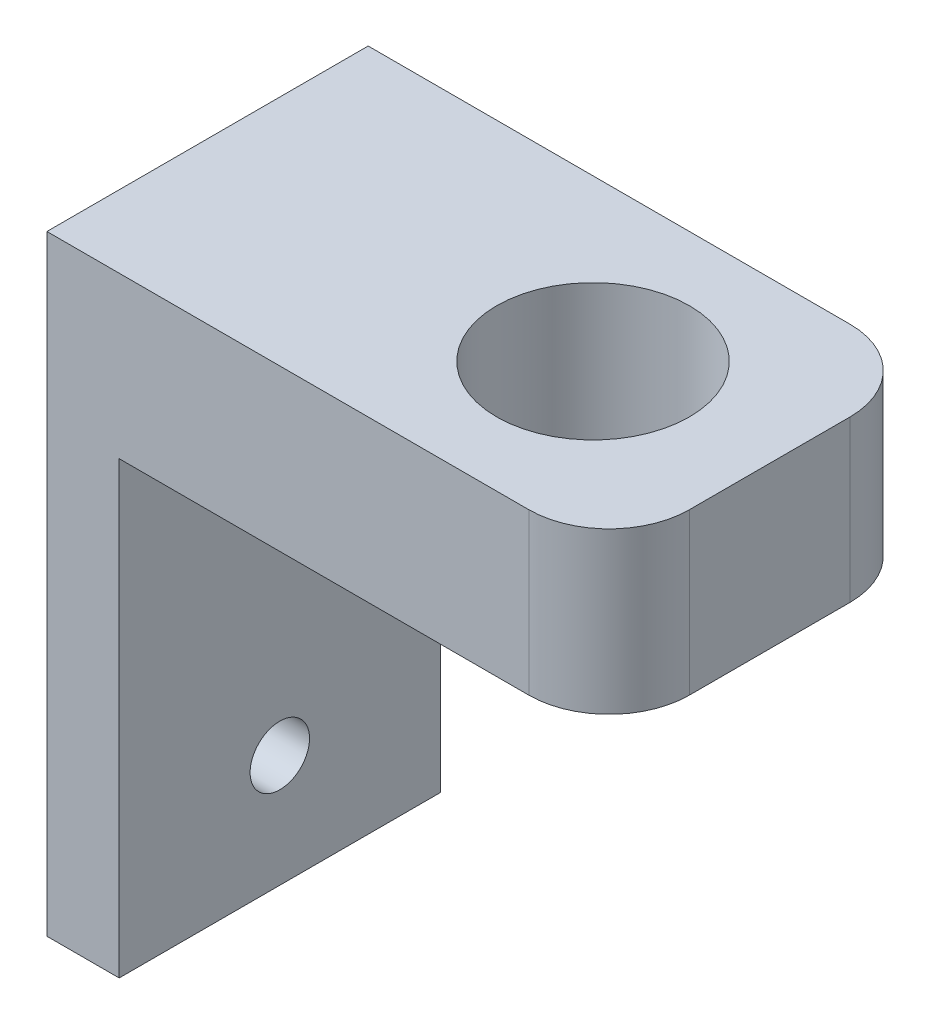
ISO-10303-21;
HEADER;
FILE_DESCRIPTION(('STEP AP214'),'2;1');
FILE_NAME('part.step','',(''),(''),'','','');
FILE_SCHEMA(('AUTOMOTIVE_DESIGN { 1 0 10303 214 1 1 1 1 }'));
ENDSEC;
DATA;
#1=APPLICATION_CONTEXT('core data for automotive mechanical design processes');
#2=APPLICATION_PROTOCOL_DEFINITION('international standard','automotive_design',2000,#1);
#3=PRODUCT_CONTEXT('',#1,'mechanical');
#4=PRODUCT('Part','Part','',(#3));
#5=PRODUCT_RELATED_PRODUCT_CATEGORY('part','',(#4));
#6=PRODUCT_DEFINITION_FORMATION('','',#4);
#7=PRODUCT_DEFINITION_CONTEXT('part definition',#1,'design');
#8=PRODUCT_DEFINITION('design','',#6,#7);
#9=PRODUCT_DEFINITION_SHAPE('','',#8);
#10=(LENGTH_UNIT() NAMED_UNIT(*) SI_UNIT(.MILLI.,.METRE.));
#11=(NAMED_UNIT(*) PLANE_ANGLE_UNIT() SI_UNIT($,.RADIAN.));
#12=(NAMED_UNIT(*) SI_UNIT($,.STERADIAN.) SOLID_ANGLE_UNIT());
#13=UNCERTAINTY_MEASURE_WITH_UNIT(LENGTH_MEASURE(1.E-05),#10,'distance_accuracy_value','');
#14=(GEOMETRIC_REPRESENTATION_CONTEXT(3) GLOBAL_UNCERTAINTY_ASSIGNED_CONTEXT((#13)) GLOBAL_UNIT_ASSIGNED_CONTEXT((#10,
#11,#12)) REPRESENTATION_CONTEXT('',''));
#15=CARTESIAN_POINT('',(0.,0.,0.));
#16=DIRECTION('',(0.,0.,1.));
#17=DIRECTION('',(1.,0.,0.));
#18=AXIS2_PLACEMENT_3D('',#15,#16,#17);
#19=CARTESIAN_POINT('',(17.5,10.,10.));
#20=DIRECTION('',(-1.,0.,0.));
#21=DIRECTION('',(0.,0.,1.));
#22=AXIS2_PLACEMENT_3D('',#19,#20,#21);
#23=PLANE('',#22);
#24=DIRECTION('',(0.,0.,-1.));
#25=VECTOR('',#24,1.);
#26=CARTESIAN_POINT('',(17.5,0.,10.));
#27=LINE('',#26,#25);
#28=CARTESIAN_POINT('',(17.5,0.,5.));
#29=VERTEX_POINT('',#28);
#30=CARTESIAN_POINT('',(17.5,0.,-5.));
#31=VERTEX_POINT('',#30);
#32=EDGE_CURVE('E153',#29,#31,#27,.T.);
#33=ORIENTED_EDGE('',*,*,#32,.T.);
#34=DIRECTION('',(0.,-1.,0.));
#35=VECTOR('',#34,1.);
#36=CARTESIAN_POINT('',(17.5,10.,-5.));
#37=LINE('',#36,#35);
#38=CARTESIAN_POINT('',(17.5,10.,-5.));
#39=VERTEX_POINT('',#38);
#40=EDGE_CURVE('E173',#31,#39,#37,.F.);
#41=ORIENTED_EDGE('',*,*,#40,.T.);
#42=DIRECTION('',(0.,0.,-1.));
#43=VECTOR('',#42,1.);
#44=CARTESIAN_POINT('',(17.5,10.,10.));
#45=LINE('',#44,#43);
#46=CARTESIAN_POINT('',(17.5,10.,5.));
#47=VERTEX_POINT('',#46);
#48=EDGE_CURVE('E155',#47,#39,#45,.T.);
#49=ORIENTED_EDGE('',*,*,#48,.F.);
#50=DIRECTION('',(0.,-1.,0.));
#51=VECTOR('',#50,1.);
#52=CARTESIAN_POINT('',(17.5,10.,5.));
#53=LINE('',#52,#51);
#54=EDGE_CURVE('E175',#47,#29,#53,.T.);
#55=ORIENTED_EDGE('',*,*,#54,.T.);
#56=EDGE_LOOP('',(#33,#41,#49,#55));
#57=FACE_BOUND('',#56,.T.);
#58=ADVANCED_FACE('F32',(#57),#23,.F.);
#59=CARTESIAN_POINT('',(-17.5,10.,-10.));
#60=DIRECTION('',(0.,0.,1.));
#61=DIRECTION('',(1.,0.,0.));
#62=AXIS2_PLACEMENT_3D('',#59,#60,#61);
#63=PLANE('',#62);
#64=DIRECTION('',(-1.,0.,0.));
#65=VECTOR('',#64,1.);
#66=CARTESIAN_POINT('',(-17.5,10.,-10.));
#67=LINE('',#66,#65);
#68=CARTESIAN_POINT('',(12.5,10.,-10.));
#69=VERTEX_POINT('',#68);
#70=CARTESIAN_POINT('',(-17.5,10.,-10.));
#71=VERTEX_POINT('',#70);
#72=EDGE_CURVE('E158',#69,#71,#67,.T.);
#73=ORIENTED_EDGE('',*,*,#72,.F.);
#74=DIRECTION('',(0.,-1.,0.));
#75=VECTOR('',#74,1.);
#76=CARTESIAN_POINT('',(12.5,10.,-10.));
#77=LINE('',#76,#75);
#78=CARTESIAN_POINT('',(12.5,0.,-10.));
#79=VERTEX_POINT('',#78);
#80=EDGE_CURVE('E109',#69,#79,#77,.T.);
#81=ORIENTED_EDGE('',*,*,#80,.T.);
#82=DIRECTION('',(-1.,0.,0.));
#83=VECTOR('',#82,1.);
#84=CARTESIAN_POINT('',(-17.5,0.,-10.));
#85=LINE('',#84,#83);
#86=CARTESIAN_POINT('',(-13.,0.,-10.));
#87=VERTEX_POINT('',#86);
#88=EDGE_CURVE('E165',#79,#87,#85,.T.);
#89=ORIENTED_EDGE('',*,*,#88,.T.);
#90=DIRECTION('',(0.,1.,0.));
#91=VECTOR('',#90,1.);
#92=CARTESIAN_POINT('',(-13.,-28.,-10.));
#93=LINE('',#92,#91);
#94=CARTESIAN_POINT('',(-13.,-28.,-10.));
#95=VERTEX_POINT('',#94);
#96=EDGE_CURVE('E116',#95,#87,#93,.T.);
#97=ORIENTED_EDGE('',*,*,#96,.F.);
#98=DIRECTION('',(1.,0.,0.));
#99=VECTOR('',#98,1.);
#100=CARTESIAN_POINT('',(-17.5,-28.,-10.));
#101=LINE('',#100,#99);
#102=CARTESIAN_POINT('',(-17.5,-28.,-10.));
#103=VERTEX_POINT('',#102);
#104=EDGE_CURVE('E113',#103,#95,#101,.T.);
#105=ORIENTED_EDGE('',*,*,#104,.F.);
#106=DIRECTION('',(0.,-1.,0.));
#107=VECTOR('',#106,1.);
#108=CARTESIAN_POINT('',(-17.5,10.,-10.));
#109=LINE('',#108,#107);
#110=EDGE_CURVE('E100',#71,#103,#109,.T.);
#111=ORIENTED_EDGE('',*,*,#110,.F.);
#112=EDGE_LOOP('',(#73,#81,#89,#97,#105,#111));
#113=FACE_BOUND('',#112,.T.);
#114=ADVANCED_FACE('F114',(#113),#63,.F.);
#115=CARTESIAN_POINT('',(-17.5,10.,10.));
#116=DIRECTION('',(1.,0.,0.));
#117=DIRECTION('',(0.,0.,-1.));
#118=AXIS2_PLACEMENT_3D('',#115,#116,#117);
#119=PLANE('',#118);
#120=CARTESIAN_POINT('',(-17.5,-6.,0.));
#121=DIRECTION('',(1.,0.,0.));
#122=DIRECTION('',(0.,0.,-1.));
#123=AXIS2_PLACEMENT_3D('',#120,#121,#122);
#124=CIRCLE('',#123,1.85);
#125=CARTESIAN_POINT('',(-17.5,-6.,-1.85));
#126=VERTEX_POINT('',#125);
#127=EDGE_CURVE('E243',#126,#126,#124,.T.);
#128=ORIENTED_EDGE('',*,*,#127,.T.);
#129=EDGE_LOOP('',(#128));
#130=FACE_BOUND('',#129,.T.);
#131=CARTESIAN_POINT('',(-17.5,-21.,0.));
#132=DIRECTION('',(1.,0.,0.));
#133=DIRECTION('',(0.,0.,-1.));
#134=AXIS2_PLACEMENT_3D('',#131,#132,#133);
#135=CIRCLE('',#134,1.85);
#136=CARTESIAN_POINT('',(-17.5,-21.,-1.85));
#137=VERTEX_POINT('',#136);
#138=EDGE_CURVE('E126',#137,#137,#135,.T.);
#139=ORIENTED_EDGE('',*,*,#138,.T.);
#140=EDGE_LOOP('',(#139));
#141=FACE_BOUND('',#140,.T.);
#142=ORIENTED_EDGE('',*,*,#110,.T.);
#143=DIRECTION('',(0.,0.,-1.));
#144=VECTOR('',#143,1.);
#145=CARTESIAN_POINT('',(-17.5,-28.,10.));
#146=LINE('',#145,#144);
#147=CARTESIAN_POINT('',(-17.5,-28.,10.));
#148=VERTEX_POINT('',#147);
#149=EDGE_CURVE('E105',#148,#103,#146,.T.);
#150=ORIENTED_EDGE('',*,*,#149,.F.);
#151=DIRECTION('',(0.,-1.,0.));
#152=VECTOR('',#151,1.);
#153=CARTESIAN_POINT('',(-17.5,10.,10.));
#154=LINE('',#153,#152);
#155=CARTESIAN_POINT('',(-17.5,10.,10.));
#156=VERTEX_POINT('',#155);
#157=EDGE_CURVE('E110',#156,#148,#154,.T.);
#158=ORIENTED_EDGE('',*,*,#157,.F.);
#159=DIRECTION('',(0.,0.,1.));
#160=VECTOR('',#159,1.);
#161=CARTESIAN_POINT('',(-17.5,10.,10.));
#162=LINE('',#161,#160);
#163=EDGE_CURVE('E106',#71,#156,#162,.T.);
#164=ORIENTED_EDGE('',*,*,#163,.F.);
#165=EDGE_LOOP('',(#142,#150,#158,#164));
#166=FACE_BOUND('',#165,.T.);
#167=ADVANCED_FACE('F102',(#130,#141,#166),#119,.F.);
#168=CARTESIAN_POINT('',(-17.5,10.,10.));
#169=DIRECTION('',(0.,0.,-1.));
#170=DIRECTION('',(-1.,0.,0.));
#171=AXIS2_PLACEMENT_3D('',#168,#169,#170);
#172=PLANE('',#171);
#173=ORIENTED_EDGE('',*,*,#157,.T.);
#174=DIRECTION('',(-1.,0.,0.));
#175=VECTOR('',#174,1.);
#176=CARTESIAN_POINT('',(-17.5,-28.,10.));
#177=LINE('',#176,#175);
#178=CARTESIAN_POINT('',(-13.,-28.,10.));
#179=VERTEX_POINT('',#178);
#180=EDGE_CURVE('E124',#179,#148,#177,.T.);
#181=ORIENTED_EDGE('',*,*,#180,.F.);
#182=DIRECTION('',(0.,1.,0.));
#183=VECTOR('',#182,1.);
#184=CARTESIAN_POINT('',(-13.,-28.,10.));
#185=LINE('',#184,#183);
#186=CARTESIAN_POINT('',(-13.,0.,10.));
#187=VERTEX_POINT('',#186);
#188=EDGE_CURVE('E134',#179,#187,#185,.T.);
#189=ORIENTED_EDGE('',*,*,#188,.T.);
#190=DIRECTION('',(1.,0.,0.));
#191=VECTOR('',#190,1.);
#192=CARTESIAN_POINT('',(-17.5,0.,10.));
#193=LINE('',#192,#191);
#194=CARTESIAN_POINT('',(12.5,0.,10.));
#195=VERTEX_POINT('',#194);
#196=EDGE_CURVE('E141',#187,#195,#193,.T.);
#197=ORIENTED_EDGE('',*,*,#196,.T.);
#198=DIRECTION('',(0.,-1.,0.));
#199=VECTOR('',#198,1.);
#200=CARTESIAN_POINT('',(12.5,10.,10.));
#201=LINE('',#200,#199);
#202=CARTESIAN_POINT('',(12.5,10.,10.));
#203=VERTEX_POINT('',#202);
#204=EDGE_CURVE('E11',#195,#203,#201,.F.);
#205=ORIENTED_EDGE('',*,*,#204,.T.);
#206=DIRECTION('',(1.,0.,0.));
#207=VECTOR('',#206,1.);
#208=CARTESIAN_POINT('',(-17.5,10.,10.));
#209=LINE('',#208,#207);
#210=EDGE_CURVE('E161',#156,#203,#209,.T.);
#211=ORIENTED_EDGE('',*,*,#210,.F.);
#212=EDGE_LOOP('',(#173,#181,#189,#197,#205,#211));
#213=FACE_BOUND('',#212,.T.);
#214=ADVANCED_FACE('F184',(#213),#172,.F.);
#215=CARTESIAN_POINT('',(0.,10.,0.));
#216=DIRECTION('',(0.,-1.,0.));
#217=DIRECTION('',(0.,0.,-1.));
#218=AXIS2_PLACEMENT_3D('',#215,#216,#217);
#219=PLANE('',#218);
#220=CARTESIAN_POINT('',(6.5,10.,0.));
#221=DIRECTION('',(0.,1.,0.));
#222=DIRECTION('',(0.,0.,1.));
#223=AXIS2_PLACEMENT_3D('',#220,#221,#222);
#224=CIRCLE('',#223,6.);
#225=CARTESIAN_POINT('',(6.5,10.,6.));
#226=VERTEX_POINT('',#225);
#227=EDGE_CURVE('E147',#226,#226,#224,.T.);
#228=ORIENTED_EDGE('',*,*,#227,.F.);
#229=EDGE_LOOP('',(#228));
#230=FACE_BOUND('',#229,.T.);
#231=ORIENTED_EDGE('',*,*,#48,.T.);
#232=CARTESIAN_POINT('',(12.5,10.,-5.));
#233=DIRECTION('',(0.,-1.,0.));
#234=DIRECTION('',(0.,0.,-1.));
#235=AXIS2_PLACEMENT_3D('',#232,#233,#234);
#236=CIRCLE('',#235,5.);
#237=EDGE_CURVE('E41',#39,#69,#236,.F.);
#238=ORIENTED_EDGE('',*,*,#237,.T.);
#239=ORIENTED_EDGE('',*,*,#72,.T.);
#240=ORIENTED_EDGE('',*,*,#163,.T.);
#241=ORIENTED_EDGE('',*,*,#210,.T.);
#242=CARTESIAN_POINT('',(12.5,10.,5.));
#243=DIRECTION('',(0.,-1.,0.));
#244=DIRECTION('',(0.,0.,-1.));
#245=AXIS2_PLACEMENT_3D('',#242,#243,#244);
#246=CIRCLE('',#245,5.);
#247=EDGE_CURVE('E171',#203,#47,#246,.F.);
#248=ORIENTED_EDGE('',*,*,#247,.T.);
#249=EDGE_LOOP('',(#231,#238,#239,#240,#241,#248));
#250=FACE_BOUND('',#249,.T.);
#251=ADVANCED_FACE('F187',(#230,#250),#219,.F.);
#252=CARTESIAN_POINT('',(0.,0.,0.));
#253=DIRECTION('',(0.,-1.,0.));
#254=DIRECTION('',(0.,0.,-1.));
#255=AXIS2_PLACEMENT_3D('',#252,#253,#254);
#256=PLANE('',#255);
#257=DIRECTION('',(0.,0.,1.));
#258=VECTOR('',#257,1.);
#259=CARTESIAN_POINT('',(-13.,0.,10.));
#260=LINE('',#259,#258);
#261=EDGE_CURVE('E49',#87,#187,#260,.T.);
#262=ORIENTED_EDGE('',*,*,#261,.F.);
#263=ORIENTED_EDGE('',*,*,#88,.F.);
#264=CARTESIAN_POINT('',(12.5,0.,-5.));
#265=DIRECTION('',(0.,-1.,0.));
#266=DIRECTION('',(0.,0.,-1.));
#267=AXIS2_PLACEMENT_3D('',#264,#265,#266);
#268=CIRCLE('',#267,5.);
#269=EDGE_CURVE('E178',#79,#31,#268,.T.);
#270=ORIENTED_EDGE('',*,*,#269,.T.);
#271=ORIENTED_EDGE('',*,*,#32,.F.);
#272=CARTESIAN_POINT('',(12.5,0.,5.));
#273=DIRECTION('',(0.,-1.,0.));
#274=DIRECTION('',(0.,0.,-1.));
#275=AXIS2_PLACEMENT_3D('',#272,#273,#274);
#276=CIRCLE('',#275,5.);
#277=EDGE_CURVE('E180',#29,#195,#276,.T.);
#278=ORIENTED_EDGE('',*,*,#277,.T.);
#279=ORIENTED_EDGE('',*,*,#196,.F.);
#280=EDGE_LOOP('',(#262,#263,#270,#271,#278,#279));
#281=FACE_BOUND('',#280,.T.);
#282=CARTESIAN_POINT('',(6.5,0.,0.));
#283=DIRECTION('',(0.,1.,0.));
#284=DIRECTION('',(0.,0.,1.));
#285=AXIS2_PLACEMENT_3D('',#282,#283,#284);
#286=CIRCLE('',#285,6.);
#287=CARTESIAN_POINT('',(6.5,0.,6.));
#288=VERTEX_POINT('',#287);
#289=EDGE_CURVE('E137',#288,#288,#286,.T.);
#290=ORIENTED_EDGE('',*,*,#289,.T.);
#291=EDGE_LOOP('',(#290));
#292=FACE_BOUND('',#291,.T.);
#293=ADVANCED_FACE('F194',(#281,#292),#256,.T.);
#294=CARTESIAN_POINT('',(12.5,10.,-5.));
#295=DIRECTION('',(0.,-1.,0.));
#296=DIRECTION('',(0.,0.,-1.));
#297=AXIS2_PLACEMENT_3D('',#294,#295,#296);
#298=CYLINDRICAL_SURFACE('',#297,5.);
#299=ORIENTED_EDGE('',*,*,#237,.F.);
#300=ORIENTED_EDGE('',*,*,#40,.F.);
#301=ORIENTED_EDGE('',*,*,#269,.F.);
#302=ORIENTED_EDGE('',*,*,#80,.F.);
#303=EDGE_LOOP('',(#299,#300,#301,#302));
#304=FACE_BOUND('',#303,.T.);
#305=ADVANCED_FACE('F199',(#304),#298,.T.);
#306=CARTESIAN_POINT('',(12.5,10.,5.));
#307=DIRECTION('',(0.,-1.,0.));
#308=DIRECTION('',(0.,0.,-1.));
#309=AXIS2_PLACEMENT_3D('',#306,#307,#308);
#310=CYLINDRICAL_SURFACE('',#309,5.);
#311=ORIENTED_EDGE('',*,*,#247,.F.);
#312=ORIENTED_EDGE('',*,*,#204,.F.);
#313=ORIENTED_EDGE('',*,*,#277,.F.);
#314=ORIENTED_EDGE('',*,*,#54,.F.);
#315=EDGE_LOOP('',(#311,#312,#313,#314));
#316=FACE_BOUND('',#315,.T.);
#317=ADVANCED_FACE('F34',(#316),#310,.T.);
#318=CARTESIAN_POINT('',(6.5,0.,0.));
#319=DIRECTION('',(0.,1.,0.));
#320=DIRECTION('',(0.,0.,1.));
#321=AXIS2_PLACEMENT_3D('',#318,#319,#320);
#322=CYLINDRICAL_SURFACE('',#321,6.);
#323=ORIENTED_EDGE('',*,*,#289,.F.);
#324=EDGE_LOOP('',(#323));
#325=FACE_BOUND('',#324,.T.);
#326=ORIENTED_EDGE('',*,*,#227,.T.);
#327=EDGE_LOOP('',(#326));
#328=FACE_BOUND('',#327,.T.);
#329=ADVANCED_FACE('F205',(#325,#328),#322,.F.);
#330=CARTESIAN_POINT('',(-13.,-28.,10.));
#331=DIRECTION('',(-1.,0.,0.));
#332=DIRECTION('',(0.,0.,1.));
#333=AXIS2_PLACEMENT_3D('',#330,#331,#332);
#334=PLANE('',#333);
#335=CARTESIAN_POINT('',(-13.,-6.,0.));
#336=DIRECTION('',(1.,0.,0.));
#337=DIRECTION('',(0.,0.,-1.));
#338=AXIS2_PLACEMENT_3D('',#335,#336,#337);
#339=CIRCLE('',#338,1.85);
#340=CARTESIAN_POINT('',(-13.,-6.,-1.85));
#341=VERTEX_POINT('',#340);
#342=EDGE_CURVE('E246',#341,#341,#339,.T.);
#343=ORIENTED_EDGE('',*,*,#342,.F.);
#344=EDGE_LOOP('',(#343));
#345=FACE_BOUND('',#344,.T.);
#346=CARTESIAN_POINT('',(-13.,-21.,0.));
#347=DIRECTION('',(1.,0.,0.));
#348=DIRECTION('',(0.,0.,-1.));
#349=AXIS2_PLACEMENT_3D('',#346,#347,#348);
#350=CIRCLE('',#349,1.85);
#351=CARTESIAN_POINT('',(-13.,-21.,-1.85));
#352=VERTEX_POINT('',#351);
#353=EDGE_CURVE('E129',#352,#352,#350,.T.);
#354=ORIENTED_EDGE('',*,*,#353,.F.);
#355=EDGE_LOOP('',(#354));
#356=FACE_BOUND('',#355,.T.);
#357=ORIENTED_EDGE('',*,*,#261,.T.);
#358=ORIENTED_EDGE('',*,*,#188,.F.);
#359=DIRECTION('',(0.,0.,1.));
#360=VECTOR('',#359,1.);
#361=CARTESIAN_POINT('',(-13.,-28.,10.));
#362=LINE('',#361,#360);
#363=EDGE_CURVE('E119',#95,#179,#362,.T.);
#364=ORIENTED_EDGE('',*,*,#363,.F.);
#365=ORIENTED_EDGE('',*,*,#96,.T.);
#366=EDGE_LOOP('',(#357,#358,#364,#365));
#367=FACE_BOUND('',#366,.T.);
#368=ADVANCED_FACE('F224',(#345,#356,#367),#334,.F.);
#369=CARTESIAN_POINT('',(0.,-28.,0.));
#370=DIRECTION('',(0.,-1.,0.));
#371=DIRECTION('',(0.,0.,-1.));
#372=AXIS2_PLACEMENT_3D('',#369,#370,#371);
#373=PLANE('',#372);
#374=ORIENTED_EDGE('',*,*,#149,.T.);
#375=ORIENTED_EDGE('',*,*,#104,.T.);
#376=ORIENTED_EDGE('',*,*,#363,.T.);
#377=ORIENTED_EDGE('',*,*,#180,.T.);
#378=EDGE_LOOP('',(#374,#375,#376,#377));
#379=FACE_BOUND('',#378,.T.);
#380=ADVANCED_FACE('F122',(#379),#373,.T.);
#381=CARTESIAN_POINT('',(-17.5,-21.,0.));
#382=DIRECTION('',(1.,0.,0.));
#383=DIRECTION('',(0.,0.,-1.));
#384=AXIS2_PLACEMENT_3D('',#381,#382,#383);
#385=CYLINDRICAL_SURFACE('',#384,1.85);
#386=ORIENTED_EDGE('',*,*,#138,.F.);
#387=EDGE_LOOP('',(#386));
#388=FACE_BOUND('',#387,.T.);
#389=ORIENTED_EDGE('',*,*,#353,.T.);
#390=EDGE_LOOP('',(#389));
#391=FACE_BOUND('',#390,.T.);
#392=ADVANCED_FACE('F231',(#388,#391),#385,.F.);
#393=CARTESIAN_POINT('',(-17.5,-6.,0.));
#394=DIRECTION('',(1.,0.,0.));
#395=DIRECTION('',(0.,0.,-1.));
#396=AXIS2_PLACEMENT_3D('',#393,#394,#395);
#397=CYLINDRICAL_SURFACE('',#396,1.85);
#398=ORIENTED_EDGE('',*,*,#127,.F.);
#399=EDGE_LOOP('',(#398));
#400=FACE_BOUND('',#399,.T.);
#401=ORIENTED_EDGE('',*,*,#342,.T.);
#402=EDGE_LOOP('',(#401));
#403=FACE_BOUND('',#402,.T.);
#404=ADVANCED_FACE('F234',(#400,#403),#397,.F.);
#405=CLOSED_SHELL('',(#58,#114,#167,#214,#251,#293,#305,#317,#329,#368,#380,#392,#404));
#406=MANIFOLD_SOLID_BREP('B2',#405);
#407=ADVANCED_BREP_SHAPE_REPRESENTATION('',(#18,#406),#14);
#408=SHAPE_DEFINITION_REPRESENTATION(#9,#407);
ENDSEC;
END-ISO-10303-21;
